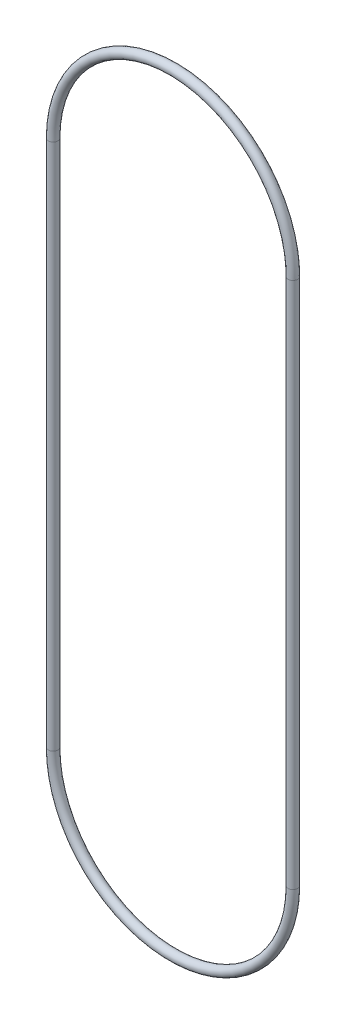
ISO-10303-21;
HEADER;
FILE_DESCRIPTION(('STEP AP214'),'2;1');
FILE_NAME('part.step','',(''),(''),'','','');
FILE_SCHEMA(('AUTOMOTIVE_DESIGN { 1 0 10303 214 1 1 1 1 }'));
ENDSEC;
DATA;
#1=APPLICATION_CONTEXT('core data for automotive mechanical design processes');
#2=APPLICATION_PROTOCOL_DEFINITION('international standard','automotive_design',2000,#1);
#3=PRODUCT_CONTEXT('',#1,'mechanical');
#4=PRODUCT('Part','Part','',(#3));
#5=PRODUCT_RELATED_PRODUCT_CATEGORY('part','',(#4));
#6=PRODUCT_DEFINITION_FORMATION('','',#4);
#7=PRODUCT_DEFINITION_CONTEXT('part definition',#1,'design');
#8=PRODUCT_DEFINITION('design','',#6,#7);
#9=PRODUCT_DEFINITION_SHAPE('','',#8);
#10=(LENGTH_UNIT() NAMED_UNIT(*) SI_UNIT(.MILLI.,.METRE.));
#11=(NAMED_UNIT(*) PLANE_ANGLE_UNIT() SI_UNIT($,.RADIAN.));
#12=(NAMED_UNIT(*) SI_UNIT($,.STERADIAN.) SOLID_ANGLE_UNIT());
#13=UNCERTAINTY_MEASURE_WITH_UNIT(LENGTH_MEASURE(1.E-05),#10,'distance_accuracy_value','');
#14=(GEOMETRIC_REPRESENTATION_CONTEXT(3) GLOBAL_UNCERTAINTY_ASSIGNED_CONTEXT((#13)) GLOBAL_UNIT_ASSIGNED_CONTEXT((#10,
#11,#12)) REPRESENTATION_CONTEXT('',''));
#15=CARTESIAN_POINT('',(0.,0.,0.));
#16=DIRECTION('',(0.,0.,1.));
#17=DIRECTION('',(1.,0.,0.));
#18=AXIS2_PLACEMENT_3D('',#15,#16,#17);
#19=CARTESIAN_POINT('',(0.,0.,0.));
#20=DIRECTION('',(0.,0.,-1.));
#21=DIRECTION('',(-1.,0.,0.));
#22=AXIS2_PLACEMENT_3D('',#19,#20,#21);
#23=TOROIDAL_SURFACE('',#22,1.25,0.0499999999999999);
#24=CARTESIAN_POINT('',(-1.25,0.,0.));
#25=DIRECTION('',(0.,-1.,0.));
#26=DIRECTION('',(0.,0.,1.));
#27=AXIS2_PLACEMENT_3D('',#24,#25,#26);
#28=CIRCLE('',#27,0.0499999999999999);
#29=CARTESIAN_POINT('',(-1.25,0.,0.0499999999999999));
#30=VERTEX_POINT('',#29);
#31=EDGE_CURVE('E73',#30,#30,#28,.T.);
#32=ORIENTED_EDGE('',*,*,#31,.F.);
#33=EDGE_LOOP('',(#32));
#34=FACE_BOUND('',#33,.T.);
#35=CARTESIAN_POINT('',(1.25,0.,0.0499999999999999));
#36=CARTESIAN_POINT('',(1.25081812391304,0.,0.0500000173544387));
#37=CARTESIAN_POINT('',(1.2516362463494,0.,0.0499799208562576));
#38=CARTESIAN_POINT('',(1.25327052108335,0.,0.0498996247642595));
#39=CARTESIAN_POINT('',(1.25408667338094,0.,0.0498394251704426));
#40=CARTESIAN_POINT('',(1.25571504065201,0.,0.0496790474967769));
#41=CARTESIAN_POINT('',(1.25652725562549,0.,0.0495788694169282));
#42=CARTESIAN_POINT('',(1.25814579182005,0.,0.0493387815795498));
#43=CARTESIAN_POINT('',(1.25895211304114,0.,0.0491988718220202));
#44=CARTESIAN_POINT('',(1.26055691916047,0.,0.0488796562183027));
#45=CARTESIAN_POINT('',(1.26135540405872,0.,0.0487003503721148));
#46=CARTESIAN_POINT('',(1.26294261393161,0.,0.0483027749473395));
#47=CARTESIAN_POINT('',(1.26373133890625,0.,0.0480845053687521));
#48=CARTESIAN_POINT('',(1.2652971288192,0.,0.0476095282044686));
#49=CARTESIAN_POINT('',(1.26607419375752,0.,0.0473528206187724));
#50=CARTESIAN_POINT('',(1.26761479158171,0.,0.0468015858995296));
#51=CARTESIAN_POINT('',(1.26837832446758,0.,0.046507058765983));
#52=CARTESIAN_POINT('',(1.26989001876893,0.,0.0458808944851456));
#53=CARTESIAN_POINT('',(1.27063818018439,0.,0.0455492573378548));
#54=CARTESIAN_POINT('',(1.27211732915864,0.,0.0448496719744894));
#55=CARTESIAN_POINT('',(1.27284831671741,0.,0.0444817237584149));
#56=CARTESIAN_POINT('',(1.27429135696519,0.,0.0437104026764205));
#57=CARTESIAN_POINT('',(1.27500340965419,0.,0.0433070298105007));
#58=CARTESIAN_POINT('',(1.27640686476513,0.,0.0424658311895264));
#59=CARTESIAN_POINT('',(1.27709826718707,0.,0.042028005434472));
#60=CARTESIAN_POINT('',(1.27845875611489,0.,0.0411189557957825));
#61=CARTESIAN_POINT('',(1.27912784262077,0.,0.0406477319121474));
#62=CARTESIAN_POINT('',(1.28044208782847,0.,0.039673021235917));
#63=CARTESIAN_POINT('',(1.2810872465303,0.,0.0391695344433218));
#64=CARTESIAN_POINT('',(1.28235208188607,0.,0.0381315108929518));
#65=CARTESIAN_POINT('',(1.28297175854001,0.,0.0375969741351772));
#66=CARTESIAN_POINT('',(1.28418413694469,0.,0.0364981384003186));
#67=CARTESIAN_POINT('',(1.28477683869542,0.,0.0359338394232347));
#68=CARTESIAN_POINT('',(1.28593383942324,0.,0.03477683869542));
#69=CARTESIAN_POINT('',(1.28649813840032,0.,0.0341841369446891));
#70=CARTESIAN_POINT('',(1.28759697413518,0.,0.0329717585400126));
#71=CARTESIAN_POINT('',(1.28813151089295,0.,0.032352081886067));
#72=CARTESIAN_POINT('',(1.28916953444332,0.,0.0310872465302975));
#73=CARTESIAN_POINT('',(1.28967302123592,0.,0.0304420878284736));
#74=CARTESIAN_POINT('',(1.29064773191215,0.,0.0291278426207696));
#75=CARTESIAN_POINT('',(1.29111895579578,0.,0.0284587561148895));
#76=CARTESIAN_POINT('',(1.29202800543447,0.,0.0270982671870707));
#77=CARTESIAN_POINT('',(1.29246583118954,0.,0.026406864765132));
#78=CARTESIAN_POINT('',(1.29330702981049,0.,0.0250034096541901));
#79=CARTESIAN_POINT('',(1.29371040267639,0.,0.024291356965187));
#80=CARTESIAN_POINT('',(1.29448172375845,0.,0.0228483167174127));
#81=CARTESIAN_POINT('',(1.29484967197461,0.,0.0221173291586414));
#82=CARTESIAN_POINT('',(1.29554925733773,0.,0.0206381801843868));
#83=CARTESIAN_POINT('',(1.29588089448468,0.,0.0198900187689034));
#84=CARTESIAN_POINT('',(1.29650705876644,0.,0.0183783244676055));
#85=CARTESIAN_POINT('',(1.29680158590125,0.,0.0176147915817912));
#86=CARTESIAN_POINT('',(1.29735282061705,0.,0.0160741937574308));
#87=CARTESIAN_POINT('',(1.29760952819805,0.,0.0152971288188849));
#88=CARTESIAN_POINT('',(1.29808450537518,0.,0.0137313389065613));
#89=CARTESIAN_POINT('',(1.29830277497131,0.,0.0129426139327837));
#90=CARTESIAN_POINT('',(1.29870035034814,0.,0.0113554040575427));
#91=CARTESIAN_POINT('',(1.29887965612884,0.,0.0105569191560793));
#92=CARTESIAN_POINT('',(1.29919887191148,0.,0.00895211304553349));
#93=CARTESIAN_POINT('',(1.29933878191341,0.,0.00814579183645105));
#94=CARTESIAN_POINT('',(1.29957886908307,0.,0.00652725560908513));
#95=CARTESIAN_POINT('',(1.29967904625078,0.,0.00571504059080165));
#96=CARTESIAN_POINT('',(1.29983942641644,0.,0.00408667344215439));
#97=CARTESIAN_POINT('',(1.29989962941437,0.,0.0032705213117906));
#98=CARTESIAN_POINT('',(1.29997991620615,0.,0.00163624612095121));
#99=CARTESIAN_POINT('',(1.3,0.,0.000818123060475602));
#100=CARTESIAN_POINT('',(1.3,0.,-0.000818123060475602));
#101=CARTESIAN_POINT('',(1.29997991620615,0.,-0.00163624612095121));
#102=CARTESIAN_POINT('',(1.29989962941437,0.,-0.0032705213117906));
#103=CARTESIAN_POINT('',(1.29983942641644,0.,-0.00408667344215439));
#104=CARTESIAN_POINT('',(1.29967904625078,0.,-0.00571504059080165));
#105=CARTESIAN_POINT('',(1.29957886908307,0.,-0.00652725560908513));
#106=CARTESIAN_POINT('',(1.29933878191341,0.,-0.00814579183645105));
#107=CARTESIAN_POINT('',(1.29919887191148,0.,-0.00895211304553349));
#108=CARTESIAN_POINT('',(1.29887965612884,0.,-0.0105569191560793));
#109=CARTESIAN_POINT('',(1.29870035034814,0.,-0.0113554040575427));
#110=CARTESIAN_POINT('',(1.29830277497131,0.,-0.0129426139327837));
#111=CARTESIAN_POINT('',(1.29808450537518,0.,-0.0137313389065613));
#112=CARTESIAN_POINT('',(1.29760952819805,0.,-0.0152971288188849));
#113=CARTESIAN_POINT('',(1.29735282061705,0.,-0.0160741937574308));
#114=CARTESIAN_POINT('',(1.29680158590125,0.,-0.0176147915817912));
#115=CARTESIAN_POINT('',(1.29650705876644,0.,-0.0183783244676055));
#116=CARTESIAN_POINT('',(1.29588089448468,0.,-0.0198900187689034));
#117=CARTESIAN_POINT('',(1.29554925733773,0.,-0.0206381801843868));
#118=CARTESIAN_POINT('',(1.29484967197461,0.,-0.0221173291586414));
#119=CARTESIAN_POINT('',(1.29448172375845,0.,-0.0228483167174127));
#120=CARTESIAN_POINT('',(1.29371040267639,0.,-0.024291356965187));
#121=CARTESIAN_POINT('',(1.29330702981049,0.,-0.0250034096541901));
#122=CARTESIAN_POINT('',(1.29246583118954,0.,-0.026406864765132));
#123=CARTESIAN_POINT('',(1.29202800543447,0.,-0.0270982671870707));
#124=CARTESIAN_POINT('',(1.29111895579578,0.,-0.0284587561148895));
#125=CARTESIAN_POINT('',(1.29064773191215,0.,-0.0291278426207696));
#126=CARTESIAN_POINT('',(1.28967302123592,0.,-0.0304420878284736));
#127=CARTESIAN_POINT('',(1.28916953444332,0.,-0.0310872465302975));
#128=CARTESIAN_POINT('',(1.28813151089295,0.,-0.032352081886067));
#129=CARTESIAN_POINT('',(1.28759697413518,0.,-0.0329717585400126));
#130=CARTESIAN_POINT('',(1.28649813840032,0.,-0.0341841369446891));
#131=CARTESIAN_POINT('',(1.28593383942324,0.,-0.03477683869542));
#132=CARTESIAN_POINT('',(1.28477683869542,0.,-0.0359338394232347));
#133=CARTESIAN_POINT('',(1.28418413694469,0.,-0.0364981384003187));
#134=CARTESIAN_POINT('',(1.28297175854001,0.,-0.0375969741351771));
#135=CARTESIAN_POINT('',(1.28235208188607,0.,-0.0381315108929517));
#136=CARTESIAN_POINT('',(1.2810872465303,0.,-0.0391695344433219));
#137=CARTESIAN_POINT('',(1.28044208782847,0.,-0.0396730212359177));
#138=CARTESIAN_POINT('',(1.27912784262077,0.,-0.0406477319121467));
#139=CARTESIAN_POINT('',(1.27845875611489,0.,-0.0411189557957801));
#140=CARTESIAN_POINT('',(1.27709826718707,0.,-0.0420280054344743));
#141=CARTESIAN_POINT('',(1.27640686476513,0.,-0.0424658311895353));
#142=CARTESIAN_POINT('',(1.27500340965419,0.,-0.0433070298104918));
#143=CARTESIAN_POINT('',(1.27429135696519,0.,-0.0437104026763874));
#144=CARTESIAN_POINT('',(1.27284831671741,0.,-0.044481723758448));
#145=CARTESIAN_POINT('',(1.27211732915864,0.,-0.044849671974613));
#146=CARTESIAN_POINT('',(1.27063818018439,0.,-0.0455492573377312));
#147=CARTESIAN_POINT('',(1.2698900187689,0.,-0.0458808944846844));
#148=CARTESIAN_POINT('',(1.26837832446761,0.,-0.0465070587664441));
#149=CARTESIAN_POINT('',(1.26761479158179,0.,-0.0468015859012506));
#150=CARTESIAN_POINT('',(1.26607419375743,0.,-0.0473528206170514));
#151=CARTESIAN_POINT('',(1.26529712881889,0.,-0.0476095281980458));
#152=CARTESIAN_POINT('',(1.26373133890656,0.,-0.048084505375175));
#153=CARTESIAN_POINT('',(1.26294261393278,0.,-0.0483027749713098));
#154=CARTESIAN_POINT('',(1.26135540405754,0.,-0.0487003503481445));
#155=CARTESIAN_POINT('',(1.26055691915608,0.,-0.0488796561288445));
#156=CARTESIAN_POINT('',(1.25895211304553,0.,-0.0491988719114785));
#157=CARTESIAN_POINT('',(1.25814579183645,0.,-0.0493387819134125));
#158=CARTESIAN_POINT('',(1.25652725560909,0.,-0.0495788690830654));
#159=CARTESIAN_POINT('',(1.2557150405908,0.,-0.0496790462507843));
#160=CARTESIAN_POINT('',(1.25408667344215,0.,-0.0498394264164353));
#161=CARTESIAN_POINT('',(1.25327052131179,0.,-0.0498996294143674));
#162=CARTESIAN_POINT('',(1.25163624612095,0.,-0.0499799162061497));
#163=CARTESIAN_POINT('',(1.25081812306048,0.,-0.0499999999999999));
#164=CARTESIAN_POINT('',(1.24918187693952,0.,-0.0499999999999999));
#165=CARTESIAN_POINT('',(1.24836375387905,0.,-0.0499799162061497));
#166=CARTESIAN_POINT('',(1.24672947868821,0.,-0.0498996294143674));
#167=CARTESIAN_POINT('',(1.24591332655785,0.,-0.0498394264164353));
#168=CARTESIAN_POINT('',(1.2442849594092,0.,-0.0496790462507843));
#169=CARTESIAN_POINT('',(1.24347274439092,0.,-0.0495788690830654));
#170=CARTESIAN_POINT('',(1.24185420816355,0.,-0.0493387819134125));
#171=CARTESIAN_POINT('',(1.24104788695447,0.,-0.0491988719114785));
#172=CARTESIAN_POINT('',(1.23944308084392,0.,-0.0488796561288445));
#173=CARTESIAN_POINT('',(1.23864459594246,0.,-0.0487003503481445));
#174=CARTESIAN_POINT('',(1.23705738606722,0.,-0.0483027749713098));
#175=CARTESIAN_POINT('',(1.23626866109344,0.,-0.048084505375175));
#176=CARTESIAN_POINT('',(1.23470287118112,0.,-0.0476095281980458));
#177=CARTESIAN_POINT('',(1.23392580624257,0.,-0.0473528206170514));
#178=CARTESIAN_POINT('',(1.23238520841821,0.,-0.0468015859012506));
#179=CARTESIAN_POINT('',(1.23162167553239,0.,-0.0465070587664441));
#180=CARTESIAN_POINT('',(1.2301099812311,0.,-0.0458808944846844));
#181=CARTESIAN_POINT('',(1.22936181981561,0.,-0.0455492573377312));
#182=CARTESIAN_POINT('',(1.22788267084136,0.,-0.044849671974613));
#183=CARTESIAN_POINT('',(1.22715168328259,0.,-0.044481723758448));
#184=CARTESIAN_POINT('',(1.22570864303481,0.,-0.0437104026763874));
#185=CARTESIAN_POINT('',(1.22499659034581,0.,-0.0433070298104918));
#186=CARTESIAN_POINT('',(1.22359313523487,0.,-0.0424658311895353));
#187=CARTESIAN_POINT('',(1.22290173281293,0.,-0.0420280054344744));
#188=CARTESIAN_POINT('',(1.22154124388511,0.,-0.0411189557957801));
#189=CARTESIAN_POINT('',(1.22087215737923,0.,-0.0406477319121467));
#190=CARTESIAN_POINT('',(1.21955791217153,0.,-0.0396730212359177));
#191=CARTESIAN_POINT('',(1.2189127534697,0.,-0.039169534443322));
#192=CARTESIAN_POINT('',(1.21764791811393,0.,-0.0381315108929517));
#193=CARTESIAN_POINT('',(1.21702824145999,0.,-0.0375969741351771));
#194=CARTESIAN_POINT('',(1.21581586305531,0.,-0.0364981384003187));
#195=CARTESIAN_POINT('',(1.21522316130458,0.,-0.0359338394232347));
#196=CARTESIAN_POINT('',(1.21406616057677,0.,-0.03477683869542));
#197=CARTESIAN_POINT('',(1.21350186159968,0.,-0.0341841369446891));
#198=CARTESIAN_POINT('',(1.21240302586482,0.,-0.0329717585400126));
#199=CARTESIAN_POINT('',(1.21186848910705,0.,-0.032352081886067));
#200=CARTESIAN_POINT('',(1.21083046555668,0.,-0.0310872465302975));
#201=CARTESIAN_POINT('',(1.21032697876408,0.,-0.0304420878284736));
#202=CARTESIAN_POINT('',(1.20935226808785,0.,-0.0291278426207696));
#203=CARTESIAN_POINT('',(1.20888104420422,0.,-0.0284587561148895));
#204=CARTESIAN_POINT('',(1.20797199456553,0.,-0.0270982671870707));
#205=CARTESIAN_POINT('',(1.20753416881047,0.,-0.026406864765132));
#206=CARTESIAN_POINT('',(1.20669297018951,0.,-0.0250034096541902));
#207=CARTESIAN_POINT('',(1.20628959732361,0.,-0.024291356965187));
#208=CARTESIAN_POINT('',(1.20551827624155,0.,-0.0228483167174127));
#209=CARTESIAN_POINT('',(1.20515032802539,0.,-0.0221173291586414));
#210=CARTESIAN_POINT('',(1.20445074266227,0.,-0.0206381801843868));
#211=CARTESIAN_POINT('',(1.20411910551532,0.,-0.0198900187689034));
#212=CARTESIAN_POINT('',(1.20349294123356,0.,-0.0183783244676056));
#213=CARTESIAN_POINT('',(1.20319841409875,0.,-0.0176147915817912));
#214=CARTESIAN_POINT('',(1.20264717938295,0.,-0.0160741937574308));
#215=CARTESIAN_POINT('',(1.20239047180195,0.,-0.0152971288188849));
#216=CARTESIAN_POINT('',(1.20191549462483,0.,-0.0137313389065613));
#217=CARTESIAN_POINT('',(1.20169722502869,0.,-0.0129426139327837));
#218=CARTESIAN_POINT('',(1.20129964965186,0.,-0.0113554040575427));
#219=CARTESIAN_POINT('',(1.20112034387116,0.,-0.0105569191560793));
#220=CARTESIAN_POINT('',(1.20080112808852,0.,-0.00895211304553349));
#221=CARTESIAN_POINT('',(1.20066121808659,0.,-0.00814579183645104));
#222=CARTESIAN_POINT('',(1.20042113091693,0.,-0.00652725560908513));
#223=CARTESIAN_POINT('',(1.20032095374922,0.,-0.00571504059080166));
#224=CARTESIAN_POINT('',(1.20016057358356,0.,-0.00408667344215439));
#225=CARTESIAN_POINT('',(1.20010037058563,0.,-0.0032705213117906));
#226=CARTESIAN_POINT('',(1.20002008379385,0.,-0.0016362461209512));
#227=CARTESIAN_POINT('',(1.2,0.,-0.000818123060475605));
#228=CARTESIAN_POINT('',(1.2,0.,0.000818123060475593));
#229=CARTESIAN_POINT('',(1.20002008379385,0.,0.00163624612095119));
#230=CARTESIAN_POINT('',(1.20010037058563,0.,0.00327052131179059));
#231=CARTESIAN_POINT('',(1.20016057358356,0.,0.00408667344215438));
#232=CARTESIAN_POINT('',(1.20032095374922,0.,0.00571504059080165));
#233=CARTESIAN_POINT('',(1.20042113091693,0.,0.00652725560908512));
#234=CARTESIAN_POINT('',(1.20066121808659,0.,0.00814579183645103));
#235=CARTESIAN_POINT('',(1.20080112808852,0.,0.00895211304553347));
#236=CARTESIAN_POINT('',(1.20112034387116,0.,0.0105569191560793));
#237=CARTESIAN_POINT('',(1.20129964965186,0.,0.0113554040575427));
#238=CARTESIAN_POINT('',(1.20169722502869,0.,0.0129426139327837));
#239=CARTESIAN_POINT('',(1.20191549462483,0.,0.0137313389065613));
#240=CARTESIAN_POINT('',(1.20239047180195,0.,0.0152971288188849));
#241=CARTESIAN_POINT('',(1.20264717938295,0.,0.0160741937574308));
#242=CARTESIAN_POINT('',(1.20319841409875,0.,0.0176147915817912));
#243=CARTESIAN_POINT('',(1.20349294123356,0.,0.0183783244676055));
#244=CARTESIAN_POINT('',(1.20411910551532,0.,0.0198900187689034));
#245=CARTESIAN_POINT('',(1.20445074266227,0.,0.0206381801843868));
#246=CARTESIAN_POINT('',(1.20515032802539,0.,0.0221173291586414));
#247=CARTESIAN_POINT('',(1.20551827624155,0.,0.0228483167174127));
#248=CARTESIAN_POINT('',(1.20628959732361,0.,0.024291356965187));
#249=CARTESIAN_POINT('',(1.20669297018951,0.,0.0250034096541901));
#250=CARTESIAN_POINT('',(1.20753416881047,0.,0.0264068647651319));
#251=CARTESIAN_POINT('',(1.20797199456553,0.,0.0270982671870706));
#252=CARTESIAN_POINT('',(1.20888104420422,0.,0.0284587561148895));
#253=CARTESIAN_POINT('',(1.20935226808785,0.,0.0291278426207696));
#254=CARTESIAN_POINT('',(1.21032697876408,0.,0.0304420878284736));
#255=CARTESIAN_POINT('',(1.21083046555668,0.,0.0310872465302975));
#256=CARTESIAN_POINT('',(1.21186848910705,0.,0.0323520818860669));
#257=CARTESIAN_POINT('',(1.21240302586482,0.,0.0329717585400126));
#258=CARTESIAN_POINT('',(1.21350186159968,0.,0.0341841369446891));
#259=CARTESIAN_POINT('',(1.21406616057677,0.,0.03477683869542));
#260=CARTESIAN_POINT('',(1.21522316130458,0.,0.0359338394232347));
#261=CARTESIAN_POINT('',(1.21581586305531,0.,0.0364981384003186));
#262=CARTESIAN_POINT('',(1.21702824145999,0.,0.0375969741351772));
#263=CARTESIAN_POINT('',(1.21764791811393,0.,0.0381315108929518));
#264=CARTESIAN_POINT('',(1.2189127534697,0.,0.0391695344433218));
#265=CARTESIAN_POINT('',(1.21955791217153,0.,0.0396730212359171));
#266=CARTESIAN_POINT('',(1.22087215737923,0.,0.0406477319121474));
#267=CARTESIAN_POINT('',(1.22154124388511,0.,0.0411189557957824));
#268=CARTESIAN_POINT('',(1.22290173281293,0.,0.0420280054344719));
#269=CARTESIAN_POINT('',(1.22359313523487,0.,0.0424658311895264));
#270=CARTESIAN_POINT('',(1.22499659034581,0.,0.0433070298105007));
#271=CARTESIAN_POINT('',(1.22570864303481,0.,0.0437104026764205));
#272=CARTESIAN_POINT('',(1.22715168328259,0.,0.0444817237584149));
#273=CARTESIAN_POINT('',(1.22788267084136,0.,0.0448496719744894));
#274=CARTESIAN_POINT('',(1.22936181981561,0.,0.0455492573378548));
#275=CARTESIAN_POINT('',(1.23010998123107,0.,0.0458808944851456));
#276=CARTESIAN_POINT('',(1.23162167553242,0.,0.046507058765983));
#277=CARTESIAN_POINT('',(1.23238520841829,0.,0.0468015858995296));
#278=CARTESIAN_POINT('',(1.23392580624248,0.,0.0473528206187724));
#279=CARTESIAN_POINT('',(1.2347028711808,0.,0.0476095282044686));
#280=CARTESIAN_POINT('',(1.23626866109375,0.,0.0480845053687521));
#281=CARTESIAN_POINT('',(1.23705738606839,0.,0.0483027749473395));
#282=CARTESIAN_POINT('',(1.23864459594128,0.,0.0487003503721148));
#283=CARTESIAN_POINT('',(1.23944308083953,0.,0.0488796562183027));
#284=CARTESIAN_POINT('',(1.24104788695886,0.,0.0491988718220202));
#285=CARTESIAN_POINT('',(1.24185420817995,0.,0.0493387815795498));
#286=CARTESIAN_POINT('',(1.24347274437451,0.,0.0495788694169282));
#287=CARTESIAN_POINT('',(1.24428495934799,0.,0.0496790474967769));
#288=CARTESIAN_POINT('',(1.24591332661906,0.,0.0498394251704426));
#289=CARTESIAN_POINT('',(1.24672947891665,0.,0.0498996247642595));
#290=CARTESIAN_POINT('',(1.2483637536506,0.,0.0499799208562576));
#291=CARTESIAN_POINT('',(1.24918187608696,0.,0.0500000173544387));
#292=CARTESIAN_POINT('',(1.25,0.,0.0499999999999999));
#293=B_SPLINE_CURVE_WITH_KNOTS('',3,(#35,#36,#37,#38,#39,#40,#41,#42,#43,#44,#45,#46,#47,#48,
#49,#50,#51,#52,#53,#54,#55,#56,#57,#58,#59,#60,#61,#62,#63,#64,#65,#66,#67,#68,#69,#70,#71,#72,
#73,#74,#75,#76,#77,#78,#79,#80,#81,#82,#83,#84,#85,#86,#87,#88,#89,#90,#91,#92,#93,#94,#95,#96,
#97,#98,#99,#100,#101,#102,#103,#104,#105,#106,#107,#108,#109,#110,#111,#112,#113,#114,#115,
#116,#117,#118,#119,#120,#121,#122,#123,#124,#125,#126,#127,#128,#129,#130,#131,#132,#133,#134,
#135,#136,#137,#138,#139,#140,#141,#142,#143,#144,#145,#146,#147,#148,#149,#150,#151,#152,#153,
#154,#155,#156,#157,#158,#159,#160,#161,#162,#163,#164,#165,#166,#167,#168,#169,#170,#171,#172,
#173,#174,#175,#176,#177,#178,#179,#180,#181,#182,#183,#184,#185,#186,#187,#188,#189,#190,#191,
#192,#193,#194,#195,#196,#197,#198,#199,#200,#201,#202,#203,#204,#205,#206,#207,#208,#209,#210,
#211,#212,#213,#214,#215,#216,#217,#218,#219,#220,#221,#222,#223,#224,#225,#226,#227,#228,#229,
#230,#231,#232,#233,#234,#235,#236,#237,#238,#239,#240,#241,#242,#243,#244,#245,#246,#247,#248,
#249,#250,#251,#252,#253,#254,#255,#256,#257,#258,#259,#260,#261,#262,#263,#264,#265,#266,#267,
#268,#269,#270,#271,#272,#273,#274,#275,#276,#277,#278,#279,#280,#281,#282,#283,#284,#285,#286,
#287,#288,#289,#290,#291,#292),.UNSPECIFIED.,.F.,.F.,(4,2,2,2,2,2,2,2,2,2,2,2,2,2,2,2,2,2,2,2,2,
2,2,2,2,2,2,2,2,2,2,2,2,2,2,2,2,2,2,2,2,2,2,2,2,2,2,2,2,2,2,2,2,2,2,2,2,2,2,2,2,2,2,2,2,2,2,2,2,
2,2,2,2,2,2,2,2,2,2,2,2,2,2,2,2,2,2,2,2,2,2,2,2,2,2,2,2,2,2,2,2,2,2,2,2,2,2,2,2,2,2,2,2,2,2,2,2,
2,2,2,2,2,2,2,2,2,2,2,4),(0.,0.00245412285229121,0.00490824570458235,0.00736236855687359,
0.00981649140916496,0.0122706142614562,0.0147247371137473,0.0171788599660387,0.0196329828183298,
0.022087105670621,0.0245412285229122,0.0269953513752034,0.0294494742274947,0.031903597079786,
0.0343577199320772,0.0368118427843684,0.0392659656366597,0.0417200884889508,0.044174211341242,
0.0466283341935333,0.0490824570458245,0.0515365798981157,0.0539907027504069,0.0564448256026982,
0.0588989484549894,0.0613530713072806,0.0638071941595719,0.0662613170118631,0.0687154398641543,
0.0711695627164455,0.0736236855687367,0.076077808421028,0.0785319312733192,0.0809860541256104,
0.0834401769779017,0.0858942998301929,0.0883484226824841,0.0908025455347753,0.0932566683870665,
0.0957107912393578,0.098164914091649,0.10061903694394,0.103073159796231,0.105527282648523,
0.107981405500814,0.110435528353105,0.112889651205396,0.115343774057688,0.117797896909979,
0.12025201976227,0.122706142614561,0.125160265466852,0.127614388319144,0.130068511171435,
0.132522634023726,0.134976756876017,0.137430879728309,0.1398850025806,0.142339125432891,
0.144793248285182,0.147247371137473,0.149701493989765,0.152155616842056,0.154609739694347,
0.157063862546638,0.15951798539893,0.161972108251221,0.164426231103512,0.166880353955803,
0.169334476808095,0.171788599660386,0.174242722512677,0.176696845364968,0.179150968217259,
0.181605091069551,0.184059213921842,0.186513336774133,0.188967459626424,0.191421582478716,
0.193875705331007,0.196329828183298,0.198783951035589,0.20123807388788,0.203692196740172,
0.206146319592463,0.208600442444754,0.211054565297045,0.213508688149337,0.215962811001628,
0.218416933853919,0.22087105670621,0.223325179558502,0.225779302410793,0.228233425263084,
0.230687548115375,0.233141670967666,0.235595793819958,0.238049916672249,0.24050403952454,
0.242958162376831,0.245412285229123,0.247866408081414,0.250320530933705,0.252774653785996,
0.255228776638288,0.257682899490579,0.26013702234287,0.262591145195161,0.265045268047452,
0.267499390899744,0.269953513752035,0.272407636604326,0.274861759456617,0.277315882308909,
0.2797700051612,0.282224128013491,0.284678250865782,0.287132373718073,0.289586496570365,
0.292040619422656,0.294494742274947,0.296948865127238,0.29940298797953,0.301857110831821,
0.304311233684112,0.306765356536403,0.309219479388695,0.311673602240986,0.314127725093277),.UNSPECIFIED.);
#294=CARTESIAN_POINT('',(1.25,0.,0.0499999999999999));
#295=VERTEX_POINT('',#294);
#296=EDGE_CURVE('E11',#295,#295,#293,.T.);
#297=ORIENTED_EDGE('',*,*,#296,.T.);
#298=EDGE_LOOP('',(#297));
#299=FACE_BOUND('',#298,.T.);
#300=ADVANCED_FACE('F63',(#34,#299),#23,.T.);
#301=CARTESIAN_POINT('',(-1.25,-5.5,0.));
#302=DIRECTION('',(0.,1.,0.));
#303=DIRECTION('',(-1.,0.,0.));
#304=AXIS2_PLACEMENT_3D('',#301,#302,#303);
#305=CYLINDRICAL_SURFACE('',#304,0.0499999999999999);
#306=CARTESIAN_POINT('',(-1.25,-5.5,0.));
#307=DIRECTION('',(0.,-1.,0.));
#308=DIRECTION('',(0.,0.,1.));
#309=AXIS2_PLACEMENT_3D('',#306,#307,#308);
#310=CIRCLE('',#309,0.0499999999999999);
#311=CARTESIAN_POINT('',(-1.3,-5.5,0.));
#312=VERTEX_POINT('',#311);
#313=EDGE_CURVE('E78',#312,#312,#310,.T.);
#314=ORIENTED_EDGE('',*,*,#313,.F.);
#315=EDGE_LOOP('',(#314));
#316=FACE_BOUND('',#315,.T.);
#317=ORIENTED_EDGE('',*,*,#31,.T.);
#318=EDGE_LOOP('',(#317));
#319=FACE_BOUND('',#318,.T.);
#320=ADVANCED_FACE('F102',(#316,#319),#305,.T.);
#321=CARTESIAN_POINT('',(0.,-5.5,0.));
#322=DIRECTION('',(0.,0.,-1.));
#323=DIRECTION('',(-1.,0.,0.));
#324=AXIS2_PLACEMENT_3D('',#321,#322,#323);
#325=TOROIDAL_SURFACE('',#324,1.25,0.0499999999999999);
#326=CARTESIAN_POINT('',(1.25,-5.5,0.));
#327=DIRECTION('',(0.,1.,0.));
#328=DIRECTION('',(0.,0.,1.));
#329=AXIS2_PLACEMENT_3D('',#326,#327,#328);
#330=CIRCLE('',#329,0.0499999999999999);
#331=CARTESIAN_POINT('',(1.3,-5.5,0.));
#332=VERTEX_POINT('',#331);
#333=EDGE_CURVE('E83',#332,#332,#330,.T.);
#334=CARTESIAN_POINT('',(0.,-5.5,0.));
#335=DIRECTION('',(0.,0.,-1.));
#336=DIRECTION('',(-1.,0.,0.));
#337=AXIS2_PLACEMENT_3D('',#334,#335,#336);
#338=CIRCLE('',#337,1.3);
#339=EDGE_CURVE('',#332,#312,#338,.T.);
#340=ORIENTED_EDGE('',*,*,#333,.F.);
#341=ORIENTED_EDGE('',*,*,#313,.T.);
#342=ORIENTED_EDGE('',*,*,#339,.T.);
#343=ORIENTED_EDGE('',*,*,#339,.F.);
#344=EDGE_LOOP('',(#340,#342,#341,#343));
#345=FACE_BOUND('',#344,.T.);
#346=ADVANCED_FACE('F97',(#345),#325,.T.);
#347=CARTESIAN_POINT('',(1.25,-5.5,0.));
#348=DIRECTION('',(0.,1.,0.));
#349=DIRECTION('',(-1.,0.,0.));
#350=AXIS2_PLACEMENT_3D('',#347,#348,#349);
#351=CYLINDRICAL_SURFACE('',#350,0.0499999999999999);
#352=ORIENTED_EDGE('',*,*,#333,.T.);
#353=EDGE_LOOP('',(#352));
#354=FACE_BOUND('',#353,.T.);
#355=ORIENTED_EDGE('',*,*,#296,.F.);
#356=EDGE_LOOP('',(#355));
#357=FACE_BOUND('',#356,.T.);
#358=ADVANCED_FACE('F95',(#354,#357),#351,.T.);
#359=CLOSED_SHELL('',(#300,#320,#346,#358));
#360=MANIFOLD_SOLID_BREP('B2',#359);
#361=ADVANCED_BREP_SHAPE_REPRESENTATION('',(#18,#360),#14);
#362=SHAPE_DEFINITION_REPRESENTATION(#9,#361);
ENDSEC;
END-ISO-10303-21;
